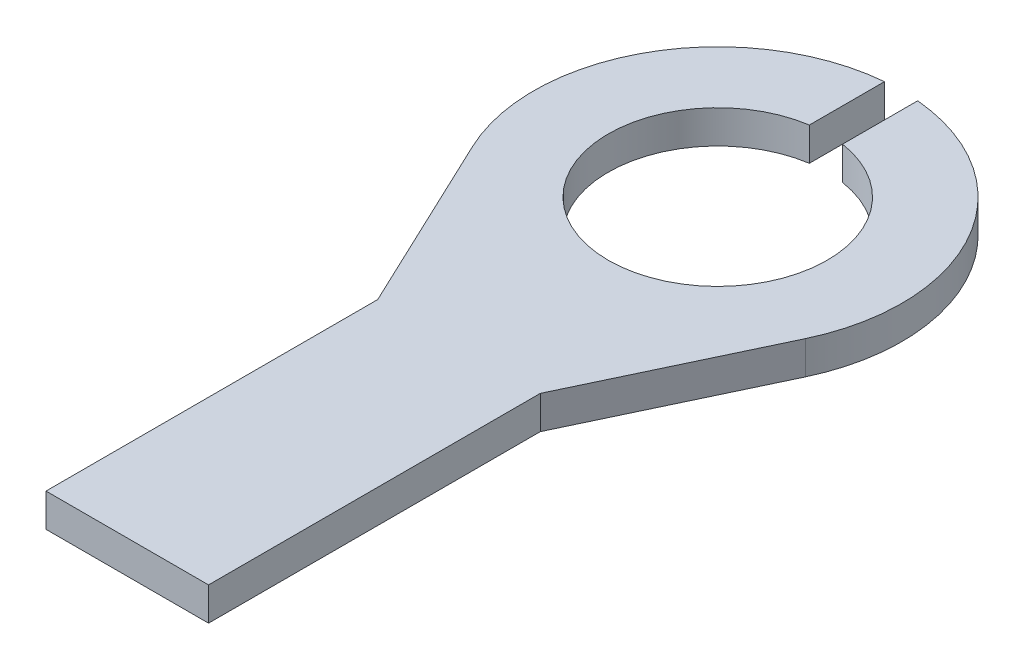
ISO-10303-21;
HEADER;
FILE_DESCRIPTION(('STEP AP214'),'2;1');
FILE_NAME('part.step','',(''),(''),'','','');
FILE_SCHEMA(('AUTOMOTIVE_DESIGN { 1 0 10303 214 1 1 1 1 }'));
ENDSEC;
DATA;
#1=APPLICATION_CONTEXT('core data for automotive mechanical design processes');
#2=APPLICATION_PROTOCOL_DEFINITION('international standard','automotive_design',2000,#1);
#3=PRODUCT_CONTEXT('',#1,'mechanical');
#4=PRODUCT('Part','Part','',(#3));
#5=PRODUCT_RELATED_PRODUCT_CATEGORY('part','',(#4));
#6=PRODUCT_DEFINITION_FORMATION('','',#4);
#7=PRODUCT_DEFINITION_CONTEXT('part definition',#1,'design');
#8=PRODUCT_DEFINITION('design','',#6,#7);
#9=PRODUCT_DEFINITION_SHAPE('','',#8);
#10=(LENGTH_UNIT() NAMED_UNIT(*) SI_UNIT(.MILLI.,.METRE.));
#11=(NAMED_UNIT(*) PLANE_ANGLE_UNIT() SI_UNIT($,.RADIAN.));
#12=(NAMED_UNIT(*) SI_UNIT($,.STERADIAN.) SOLID_ANGLE_UNIT());
#13=UNCERTAINTY_MEASURE_WITH_UNIT(LENGTH_MEASURE(1.E-05),#10,'distance_accuracy_value','');
#14=(GEOMETRIC_REPRESENTATION_CONTEXT(3) GLOBAL_UNCERTAINTY_ASSIGNED_CONTEXT((#13)) GLOBAL_UNIT_ASSIGNED_CONTEXT((#10,
#11,#12)) REPRESENTATION_CONTEXT('',''));
#15=CARTESIAN_POINT('',(0.,0.,0.));
#16=DIRECTION('',(0.,0.,1.));
#17=DIRECTION('',(1.,0.,0.));
#18=AXIS2_PLACEMENT_3D('',#15,#16,#17);
#19=CARTESIAN_POINT('',(-1.27432393723283,0.254,0.602787353048663));
#20=DIRECTION('',(0.903968175663497,0.,-0.427599739695441));
#21=DIRECTION('',(-0.427599739695441,0.,-0.903968175663497));
#22=AXIS2_PLACEMENT_3D('',#19,#20,#21);
#23=PLANE('',#22);
#24=DIRECTION('',(0.427599739695441,0.,0.903968175663497));
#25=VECTOR('',#24,1.);
#26=CARTESIAN_POINT('',(-1.27432393723283,0.,0.602787353048663));
#27=LINE('',#26,#25);
#28=CARTESIAN_POINT('',(-1.27432393723283,0.,0.602787353048662));
#29=VERTEX_POINT('',#28);
#30=CARTESIAN_POINT('',(-0.622300000000001,0.,1.9812));
#31=VERTEX_POINT('',#30);
#32=EDGE_CURVE('E145',#29,#31,#27,.T.);
#33=ORIENTED_EDGE('',*,*,#32,.T.);
#34=DIRECTION('',(0.,-1.,0.));
#35=VECTOR('',#34,1.);
#36=CARTESIAN_POINT('',(-0.622300000000001,0.254,1.9812));
#37=LINE('',#36,#35);
#38=CARTESIAN_POINT('',(-0.622300000000001,0.254,1.9812));
#39=VERTEX_POINT('',#38);
#40=EDGE_CURVE('E11',#39,#31,#37,.T.);
#41=ORIENTED_EDGE('',*,*,#40,.F.);
#42=DIRECTION('',(0.427599739695441,0.,0.903968175663497));
#43=VECTOR('',#42,1.);
#44=CARTESIAN_POINT('',(-1.27432393723283,0.254,0.602787353048663));
#45=LINE('',#44,#43);
#46=CARTESIAN_POINT('',(-1.27432393723283,0.254,0.602787353048662));
#47=VERTEX_POINT('',#46);
#48=EDGE_CURVE('E210',#47,#39,#45,.T.);
#49=ORIENTED_EDGE('',*,*,#48,.F.);
#50=DIRECTION('',(0.,-1.,0.));
#51=VECTOR('',#50,1.);
#52=CARTESIAN_POINT('',(-1.27432393723283,0.254,0.602787353048662));
#53=LINE('',#52,#51);
#54=EDGE_CURVE('E140',#47,#29,#53,.T.);
#55=ORIENTED_EDGE('',*,*,#54,.T.);
#56=EDGE_LOOP('',(#33,#41,#49,#55));
#57=FACE_BOUND('',#56,.T.);
#58=ADVANCED_FACE('F38',(#57),#23,.F.);
#59=CARTESIAN_POINT('',(-0.622300000000001,0.254,0.));
#60=DIRECTION('',(1.,0.,0.));
#61=DIRECTION('',(0.,0.,-1.));
#62=AXIS2_PLACEMENT_3D('',#59,#60,#61);
#63=PLANE('',#62);
#64=DIRECTION('',(0.,0.,1.));
#65=VECTOR('',#64,1.);
#66=CARTESIAN_POINT('',(-0.622300000000001,0.,0.));
#67=LINE('',#66,#65);
#68=CARTESIAN_POINT('',(-0.6223,0.,4.5212));
#69=VERTEX_POINT('',#68);
#70=EDGE_CURVE('E148',#31,#69,#67,.T.);
#71=ORIENTED_EDGE('',*,*,#70,.T.);
#72=DIRECTION('',(0.,-1.,0.));
#73=VECTOR('',#72,1.);
#74=CARTESIAN_POINT('',(-0.6223,0.254,4.5212));
#75=LINE('',#74,#73);
#76=CARTESIAN_POINT('',(-0.6223,0.254,4.5212));
#77=VERTEX_POINT('',#76);
#78=EDGE_CURVE('E46',#77,#69,#75,.T.);
#79=ORIENTED_EDGE('',*,*,#78,.F.);
#80=DIRECTION('',(0.,0.,1.));
#81=VECTOR('',#80,1.);
#82=CARTESIAN_POINT('',(-0.622300000000001,0.254,0.));
#83=LINE('',#82,#81);
#84=EDGE_CURVE('E99',#39,#77,#83,.T.);
#85=ORIENTED_EDGE('',*,*,#84,.F.);
#86=ORIENTED_EDGE('',*,*,#40,.T.);
#87=EDGE_LOOP('',(#71,#79,#85,#86));
#88=FACE_BOUND('',#87,.T.);
#89=ADVANCED_FACE('F215',(#88),#63,.F.);
#90=CARTESIAN_POINT('',(0.,0.254,4.5212));
#91=DIRECTION('',(0.,0.,-1.));
#92=DIRECTION('',(-1.,0.,0.));
#93=AXIS2_PLACEMENT_3D('',#90,#91,#92);
#94=PLANE('',#93);
#95=DIRECTION('',(1.,0.,0.));
#96=VECTOR('',#95,1.);
#97=CARTESIAN_POINT('',(0.,0.,4.5212));
#98=LINE('',#97,#96);
#99=CARTESIAN_POINT('',(0.6223,0.,4.5212));
#100=VERTEX_POINT('',#99);
#101=EDGE_CURVE('E150',#69,#100,#98,.T.);
#102=ORIENTED_EDGE('',*,*,#101,.T.);
#103=DIRECTION('',(0.,-1.,0.));
#104=VECTOR('',#103,1.);
#105=CARTESIAN_POINT('',(0.6223,0.254,4.5212));
#106=LINE('',#105,#104);
#107=CARTESIAN_POINT('',(0.6223,0.254,4.5212));
#108=VERTEX_POINT('',#107);
#109=EDGE_CURVE('E176',#108,#100,#106,.T.);
#110=ORIENTED_EDGE('',*,*,#109,.F.);
#111=DIRECTION('',(1.,0.,0.));
#112=VECTOR('',#111,1.);
#113=CARTESIAN_POINT('',(0.,0.254,4.5212));
#114=LINE('',#113,#112);
#115=EDGE_CURVE('E184',#77,#108,#114,.T.);
#116=ORIENTED_EDGE('',*,*,#115,.F.);
#117=ORIENTED_EDGE('',*,*,#78,.T.);
#118=EDGE_LOOP('',(#102,#110,#116,#117));
#119=FACE_BOUND('',#118,.T.);
#120=ADVANCED_FACE('F182',(#119),#94,.F.);
#121=CARTESIAN_POINT('',(0.622300000000001,0.254,0.));
#122=DIRECTION('',(-1.,0.,0.));
#123=DIRECTION('',(0.,0.,1.));
#124=AXIS2_PLACEMENT_3D('',#121,#122,#123);
#125=PLANE('',#124);
#126=DIRECTION('',(0.,0.,-1.));
#127=VECTOR('',#126,1.);
#128=CARTESIAN_POINT('',(0.622300000000001,0.,0.));
#129=LINE('',#128,#127);
#130=CARTESIAN_POINT('',(0.6223,0.,1.9812));
#131=VERTEX_POINT('',#130);
#132=EDGE_CURVE('E152',#100,#131,#129,.T.);
#133=ORIENTED_EDGE('',*,*,#132,.T.);
#134=DIRECTION('',(0.,-1.,0.));
#135=VECTOR('',#134,1.);
#136=CARTESIAN_POINT('',(0.6223,0.254,1.9812));
#137=LINE('',#136,#135);
#138=CARTESIAN_POINT('',(0.6223,0.254,1.9812));
#139=VERTEX_POINT('',#138);
#140=EDGE_CURVE('E174',#139,#131,#137,.T.);
#141=ORIENTED_EDGE('',*,*,#140,.F.);
#142=DIRECTION('',(0.,0.,-1.));
#143=VECTOR('',#142,1.);
#144=CARTESIAN_POINT('',(0.622300000000001,0.254,0.));
#145=LINE('',#144,#143);
#146=EDGE_CURVE('E196',#108,#139,#145,.T.);
#147=ORIENTED_EDGE('',*,*,#146,.F.);
#148=ORIENTED_EDGE('',*,*,#109,.T.);
#149=EDGE_LOOP('',(#133,#141,#147,#148));
#150=FACE_BOUND('',#149,.T.);
#151=ADVANCED_FACE('F193',(#150),#125,.F.);
#152=CARTESIAN_POINT('',(1.27432393723283,0.254,0.602787353048661));
#153=DIRECTION('',(0.903968175663498,0.,0.42759973969544));
#154=DIRECTION('',(0.42759973969544,0.,-0.903968175663498));
#155=AXIS2_PLACEMENT_3D('',#152,#153,#154);
#156=PLANE('',#155);
#157=DIRECTION('',(-0.42759973969544,0.,0.903968175663498));
#158=VECTOR('',#157,1.);
#159=CARTESIAN_POINT('',(1.27432393723283,0.,0.602787353048661));
#160=LINE('',#159,#158);
#161=CARTESIAN_POINT('',(1.27432393723283,0.,0.602787353048662));
#162=VERTEX_POINT('',#161);
#163=EDGE_CURVE('E155',#162,#131,#160,.T.);
#164=ORIENTED_EDGE('',*,*,#163,.F.);
#165=DIRECTION('',(0.,-1.,0.));
#166=VECTOR('',#165,1.);
#167=CARTESIAN_POINT('',(1.27432393723283,0.254,0.602787353048662));
#168=LINE('',#167,#166);
#169=CARTESIAN_POINT('',(1.27432393723283,0.254,0.602787353048662));
#170=VERTEX_POINT('',#169);
#171=EDGE_CURVE('E172',#170,#162,#168,.T.);
#172=ORIENTED_EDGE('',*,*,#171,.F.);
#173=DIRECTION('',(-0.42759973969544,0.,0.903968175663498));
#174=VECTOR('',#173,1.);
#175=CARTESIAN_POINT('',(1.27432393723283,0.254,0.602787353048661));
#176=LINE('',#175,#174);
#177=EDGE_CURVE('E198',#170,#139,#176,.T.);
#178=ORIENTED_EDGE('',*,*,#177,.T.);
#179=ORIENTED_EDGE('',*,*,#140,.T.);
#180=EDGE_LOOP('',(#164,#172,#178,#179));
#181=FACE_BOUND('',#180,.T.);
#182=ADVANCED_FACE('F225',(#181),#156,.T.);
#183=CARTESIAN_POINT('',(0.,0.254,0.));
#184=DIRECTION('',(0.,-1.,0.));
#185=DIRECTION('',(0.,0.,-1.));
#186=AXIS2_PLACEMENT_3D('',#183,#184,#185);
#187=CYLINDRICAL_SURFACE('',#186,1.4097);
#188=CARTESIAN_POINT('',(0.,0.,0.));
#189=DIRECTION('',(0.,1.,0.));
#190=DIRECTION('',(0.,0.,1.));
#191=AXIS2_PLACEMENT_3D('',#188,#189,#190);
#192=CIRCLE('',#191,1.4097);
#193=CARTESIAN_POINT('',(0.127,0.,-1.40396762427059));
#194=VERTEX_POINT('',#193);
#195=EDGE_CURVE('E158',#162,#194,#192,.T.);
#196=ORIENTED_EDGE('',*,*,#195,.T.);
#197=DIRECTION('',(0.,-1.,0.));
#198=VECTOR('',#197,1.);
#199=CARTESIAN_POINT('',(0.127,0.254,-1.40396762427059));
#200=LINE('',#199,#198);
#201=CARTESIAN_POINT('',(0.127,0.254,-1.40396762427059));
#202=VERTEX_POINT('',#201);
#203=EDGE_CURVE('E169',#202,#194,#200,.T.);
#204=ORIENTED_EDGE('',*,*,#203,.F.);
#205=CARTESIAN_POINT('',(0.,0.254,0.));
#206=DIRECTION('',(0.,1.,0.));
#207=DIRECTION('',(0.,0.,1.));
#208=AXIS2_PLACEMENT_3D('',#205,#206,#207);
#209=CIRCLE('',#208,1.4097);
#210=EDGE_CURVE('E142',#170,#202,#209,.T.);
#211=ORIENTED_EDGE('',*,*,#210,.F.);
#212=ORIENTED_EDGE('',*,*,#171,.T.);
#213=EDGE_LOOP('',(#196,#204,#211,#212));
#214=FACE_BOUND('',#213,.T.);
#215=ADVANCED_FACE('F206',(#214),#187,.T.);
#216=CARTESIAN_POINT('',(0.127,0.254,0.));
#217=DIRECTION('',(1.,0.,0.));
#218=DIRECTION('',(0.,0.,-1.));
#219=AXIS2_PLACEMENT_3D('',#216,#217,#218);
#220=PLANE('',#219);
#221=DIRECTION('',(0.,0.,1.));
#222=VECTOR('',#221,1.);
#223=CARTESIAN_POINT('',(0.127,0.,0.));
#224=LINE('',#223,#222);
#225=CARTESIAN_POINT('',(0.127,0.,-0.828522926659245));
#226=VERTEX_POINT('',#225);
#227=EDGE_CURVE('E160',#194,#226,#224,.T.);
#228=ORIENTED_EDGE('',*,*,#227,.T.);
#229=DIRECTION('',(0.,-1.,0.));
#230=VECTOR('',#229,1.);
#231=CARTESIAN_POINT('',(0.127,0.254,-0.828522926659245));
#232=LINE('',#231,#230);
#233=CARTESIAN_POINT('',(0.127,0.254,-0.828522926659245));
#234=VERTEX_POINT('',#233);
#235=EDGE_CURVE('E130',#234,#226,#232,.T.);
#236=ORIENTED_EDGE('',*,*,#235,.F.);
#237=DIRECTION('',(0.,0.,1.));
#238=VECTOR('',#237,1.);
#239=CARTESIAN_POINT('',(0.127,0.254,0.));
#240=LINE('',#239,#238);
#241=EDGE_CURVE('E135',#202,#234,#240,.T.);
#242=ORIENTED_EDGE('',*,*,#241,.F.);
#243=ORIENTED_EDGE('',*,*,#203,.T.);
#244=EDGE_LOOP('',(#228,#236,#242,#243));
#245=FACE_BOUND('',#244,.T.);
#246=ADVANCED_FACE('F209',(#245),#220,.F.);
#247=CARTESIAN_POINT('',(0.,0.254,0.));
#248=DIRECTION('',(0.,-1.,0.));
#249=DIRECTION('',(0.,0.,-1.));
#250=AXIS2_PLACEMENT_3D('',#247,#248,#249);
#251=CYLINDRICAL_SURFACE('',#250,0.8382);
#252=CARTESIAN_POINT('',(0.,0.,0.));
#253=DIRECTION('',(0.,1.,0.));
#254=DIRECTION('',(0.,0.,1.));
#255=AXIS2_PLACEMENT_3D('',#252,#253,#254);
#256=CIRCLE('',#255,0.8382);
#257=CARTESIAN_POINT('',(-0.127,0.,-0.828522926659245));
#258=VERTEX_POINT('',#257);
#259=EDGE_CURVE('E125',#258,#226,#256,.T.);
#260=ORIENTED_EDGE('',*,*,#259,.F.);
#261=DIRECTION('',(0.,-1.,0.));
#262=VECTOR('',#261,1.);
#263=CARTESIAN_POINT('',(-0.127,0.254,-0.828522926659245));
#264=LINE('',#263,#262);
#265=CARTESIAN_POINT('',(-0.127,0.254,-0.828522926659245));
#266=VERTEX_POINT('',#265);
#267=EDGE_CURVE('E120',#266,#258,#264,.T.);
#268=ORIENTED_EDGE('',*,*,#267,.F.);
#269=CARTESIAN_POINT('',(0.,0.254,0.));
#270=DIRECTION('',(0.,1.,0.));
#271=DIRECTION('',(0.,0.,1.));
#272=AXIS2_PLACEMENT_3D('',#269,#270,#271);
#273=CIRCLE('',#272,0.8382);
#274=EDGE_CURVE('E123',#266,#234,#273,.T.);
#275=ORIENTED_EDGE('',*,*,#274,.T.);
#276=ORIENTED_EDGE('',*,*,#235,.T.);
#277=EDGE_LOOP('',(#260,#268,#275,#276));
#278=FACE_BOUND('',#277,.T.);
#279=ADVANCED_FACE('F122',(#278),#251,.F.);
#280=CARTESIAN_POINT('',(-0.126999999999998,0.254,0.));
#281=DIRECTION('',(1.,0.,0.));
#282=DIRECTION('',(0.,0.,-1.));
#283=AXIS2_PLACEMENT_3D('',#280,#281,#282);
#284=PLANE('',#283);
#285=DIRECTION('',(0.,0.,1.));
#286=VECTOR('',#285,1.);
#287=CARTESIAN_POINT('',(-0.126999999999998,0.,0.));
#288=LINE('',#287,#286);
#289=CARTESIAN_POINT('',(-0.127000000000001,0.,-1.40396762427059));
#290=VERTEX_POINT('',#289);
#291=EDGE_CURVE('E164',#290,#258,#288,.T.);
#292=ORIENTED_EDGE('',*,*,#291,.F.);
#293=DIRECTION('',(0.,-1.,0.));
#294=VECTOR('',#293,1.);
#295=CARTESIAN_POINT('',(-0.127000000000001,0.254,-1.40396762427059));
#296=LINE('',#295,#294);
#297=CARTESIAN_POINT('',(-0.127000000000001,0.254,-1.40396762427059));
#298=VERTEX_POINT('',#297);
#299=EDGE_CURVE('E88',#298,#290,#296,.T.);
#300=ORIENTED_EDGE('',*,*,#299,.F.);
#301=DIRECTION('',(0.,0.,1.));
#302=VECTOR('',#301,1.);
#303=CARTESIAN_POINT('',(-0.126999999999998,0.254,0.));
#304=LINE('',#303,#302);
#305=EDGE_CURVE('E133',#298,#266,#304,.T.);
#306=ORIENTED_EDGE('',*,*,#305,.T.);
#307=ORIENTED_EDGE('',*,*,#267,.T.);
#308=EDGE_LOOP('',(#292,#300,#306,#307));
#309=FACE_BOUND('',#308,.T.);
#310=ADVANCED_FACE('F138',(#309),#284,.T.);
#311=EDGE_CURVE('E91',#290,#29,#192,.T.);
#312=ORIENTED_EDGE('',*,*,#311,.T.);
#313=ORIENTED_EDGE('',*,*,#54,.F.);
#314=EDGE_CURVE('E54',#298,#47,#209,.T.);
#315=ORIENTED_EDGE('',*,*,#314,.F.);
#316=ORIENTED_EDGE('',*,*,#299,.T.);
#317=EDGE_LOOP('',(#312,#313,#315,#316));
#318=FACE_BOUND('',#317,.T.);
#319=ADVANCED_FACE('F235',(#318),#187,.T.);
#320=CARTESIAN_POINT('',(0.,0.254,0.));
#321=DIRECTION('',(0.,1.,0.));
#322=DIRECTION('',(0.,0.,1.));
#323=AXIS2_PLACEMENT_3D('',#320,#321,#322);
#324=PLANE('',#323);
#325=ORIENTED_EDGE('',*,*,#48,.T.);
#326=ORIENTED_EDGE('',*,*,#84,.T.);
#327=ORIENTED_EDGE('',*,*,#115,.T.);
#328=ORIENTED_EDGE('',*,*,#146,.T.);
#329=ORIENTED_EDGE('',*,*,#177,.F.);
#330=ORIENTED_EDGE('',*,*,#210,.T.);
#331=ORIENTED_EDGE('',*,*,#241,.T.);
#332=ORIENTED_EDGE('',*,*,#274,.F.);
#333=ORIENTED_EDGE('',*,*,#305,.F.);
#334=ORIENTED_EDGE('',*,*,#314,.T.);
#335=EDGE_LOOP('',(#325,#326,#327,#328,#329,#330,#331,#332,#333,#334));
#336=FACE_BOUND('',#335,.T.);
#337=ADVANCED_FACE('F132',(#336),#324,.T.);
#338=CARTESIAN_POINT('',(0.,0.,0.));
#339=DIRECTION('',(0.,1.,0.));
#340=DIRECTION('',(0.,0.,1.));
#341=AXIS2_PLACEMENT_3D('',#338,#339,#340);
#342=PLANE('',#341);
#343=ORIENTED_EDGE('',*,*,#32,.F.);
#344=ORIENTED_EDGE('',*,*,#311,.F.);
#345=ORIENTED_EDGE('',*,*,#291,.T.);
#346=ORIENTED_EDGE('',*,*,#259,.T.);
#347=ORIENTED_EDGE('',*,*,#227,.F.);
#348=ORIENTED_EDGE('',*,*,#195,.F.);
#349=ORIENTED_EDGE('',*,*,#163,.T.);
#350=ORIENTED_EDGE('',*,*,#132,.F.);
#351=ORIENTED_EDGE('',*,*,#101,.F.);
#352=ORIENTED_EDGE('',*,*,#70,.F.);
#353=EDGE_LOOP('',(#343,#344,#345,#346,#347,#348,#349,#350,#351,#352));
#354=FACE_BOUND('',#353,.T.);
#355=ADVANCED_FACE('F188',(#354),#342,.F.);
#356=CLOSED_SHELL('',(#58,#89,#120,#151,#182,#215,#246,#279,#310,#319,#337,#355));
#357=MANIFOLD_SOLID_BREP('B2',#356);
#358=ADVANCED_BREP_SHAPE_REPRESENTATION('',(#18,#357),#14);
#359=SHAPE_DEFINITION_REPRESENTATION(#9,#358);
ENDSEC;
END-ISO-10303-21;
